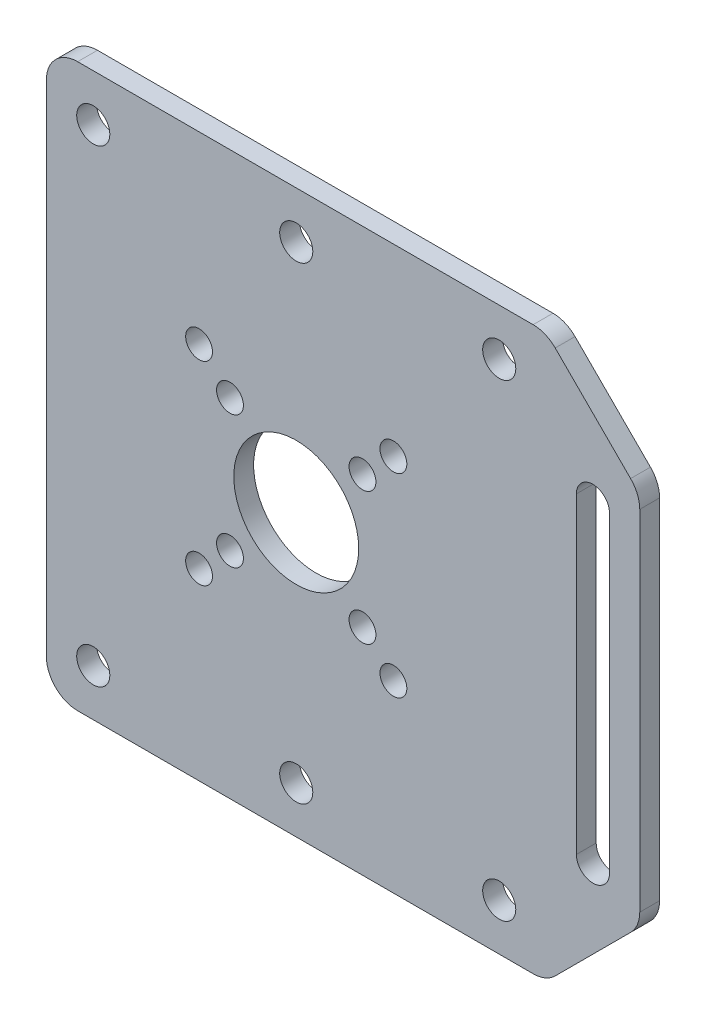
ISO-10303-21;
HEADER;
FILE_DESCRIPTION(('STEP AP214'),'2;1');
FILE_NAME('part.step','',(''),(''),'','','');
FILE_SCHEMA(('AUTOMOTIVE_DESIGN { 1 0 10303 214 1 1 1 1 }'));
ENDSEC;
DATA;
#1=APPLICATION_CONTEXT('core data for automotive mechanical design processes');
#2=APPLICATION_PROTOCOL_DEFINITION('international standard','automotive_design',2000,#1);
#3=PRODUCT_CONTEXT('',#1,'mechanical');
#4=PRODUCT('Part','Part','',(#3));
#5=PRODUCT_RELATED_PRODUCT_CATEGORY('part','',(#4));
#6=PRODUCT_DEFINITION_FORMATION('','',#4);
#7=PRODUCT_DEFINITION_CONTEXT('part definition',#1,'design');
#8=PRODUCT_DEFINITION('design','',#6,#7);
#9=PRODUCT_DEFINITION_SHAPE('','',#8);
#10=(LENGTH_UNIT() NAMED_UNIT(*) SI_UNIT(.MILLI.,.METRE.));
#11=(NAMED_UNIT(*) PLANE_ANGLE_UNIT() SI_UNIT($,.RADIAN.));
#12=(NAMED_UNIT(*) SI_UNIT($,.STERADIAN.) SOLID_ANGLE_UNIT());
#13=UNCERTAINTY_MEASURE_WITH_UNIT(LENGTH_MEASURE(1.E-05),#10,'distance_accuracy_value','');
#14=(GEOMETRIC_REPRESENTATION_CONTEXT(3) GLOBAL_UNCERTAINTY_ASSIGNED_CONTEXT((#13)) GLOBAL_UNIT_ASSIGNED_CONTEXT((#10,
#11,#12)) REPRESENTATION_CONTEXT('',''));
#15=CARTESIAN_POINT('',(0.,0.,0.));
#16=DIRECTION('',(0.,0.,1.));
#17=DIRECTION('',(1.,0.,0.));
#18=AXIS2_PLACEMENT_3D('',#15,#16,#17);
#19=CARTESIAN_POINT('',(-40.,45.,-3.175));
#20=DIRECTION('',(-1.,0.,0.));
#21=DIRECTION('',(0.,0.,1.));
#22=AXIS2_PLACEMENT_3D('',#19,#20,#21);
#23=PLANE('',#22);
#24=DIRECTION('',(0.,-1.,0.));
#25=VECTOR('',#24,1.);
#26=CARTESIAN_POINT('',(-40.,45.,-3.175));
#27=LINE('',#26,#25);
#28=CARTESIAN_POINT('',(-40.,40.,-3.175));
#29=VERTEX_POINT('',#28);
#30=CARTESIAN_POINT('',(-40.,-40.,-3.175));
#31=VERTEX_POINT('',#30);
#32=EDGE_CURVE('E207',#29,#31,#27,.T.);
#33=ORIENTED_EDGE('',*,*,#32,.T.);
#34=DIRECTION('',(0.,0.,1.));
#35=VECTOR('',#34,1.);
#36=CARTESIAN_POINT('',(-40.,-40.,-3.175));
#37=LINE('',#36,#35);
#38=CARTESIAN_POINT('',(-40.,-40.,0.));
#39=VERTEX_POINT('',#38);
#40=EDGE_CURVE('E11',#31,#39,#37,.T.);
#41=ORIENTED_EDGE('',*,*,#40,.T.);
#42=DIRECTION('',(0.,-1.,0.));
#43=VECTOR('',#42,1.);
#44=CARTESIAN_POINT('',(-40.,45.,0.));
#45=LINE('',#44,#43);
#46=CARTESIAN_POINT('',(-40.,40.,0.));
#47=VERTEX_POINT('',#46);
#48=EDGE_CURVE('E204',#47,#39,#45,.T.);
#49=ORIENTED_EDGE('',*,*,#48,.F.);
#50=DIRECTION('',(0.,0.,1.));
#51=VECTOR('',#50,1.);
#52=CARTESIAN_POINT('',(-40.,40.,-3.175));
#53=LINE('',#52,#51);
#54=EDGE_CURVE('E47',#47,#29,#53,.F.);
#55=ORIENTED_EDGE('',*,*,#54,.T.);
#56=EDGE_LOOP('',(#33,#41,#49,#55));
#57=FACE_BOUND('',#56,.T.);
#58=ADVANCED_FACE('F39',(#57),#23,.T.);
#59=CARTESIAN_POINT('',(-40.,45.,-3.175));
#60=DIRECTION('',(0.,1.,0.));
#61=DIRECTION('',(0.,0.,1.));
#62=AXIS2_PLACEMENT_3D('',#59,#60,#61);
#63=PLANE('',#62);
#64=DIRECTION('',(-1.,0.,0.));
#65=VECTOR('',#64,1.);
#66=CARTESIAN_POINT('',(-40.,45.,0.));
#67=LINE('',#66,#65);
#68=CARTESIAN_POINT('',(37.9289321881345,45.,0.));
#69=VERTEX_POINT('',#68);
#70=CARTESIAN_POINT('',(-35.,45.,0.));
#71=VERTEX_POINT('',#70);
#72=EDGE_CURVE('E211',#69,#71,#67,.T.);
#73=ORIENTED_EDGE('',*,*,#72,.F.);
#74=DIRECTION('',(0.,0.,1.));
#75=VECTOR('',#74,1.);
#76=CARTESIAN_POINT('',(37.9289321881345,45.,-3.175));
#77=LINE('',#76,#75);
#78=CARTESIAN_POINT('',(37.9289321881345,45.,-3.175));
#79=VERTEX_POINT('',#78);
#80=EDGE_CURVE('E286',#69,#79,#77,.F.);
#81=ORIENTED_EDGE('',*,*,#80,.T.);
#82=DIRECTION('',(-1.,0.,0.));
#83=VECTOR('',#82,1.);
#84=CARTESIAN_POINT('',(-40.,45.,-3.175));
#85=LINE('',#84,#83);
#86=CARTESIAN_POINT('',(-35.,45.,-3.175));
#87=VERTEX_POINT('',#86);
#88=EDGE_CURVE('E222',#79,#87,#85,.T.);
#89=ORIENTED_EDGE('',*,*,#88,.T.);
#90=DIRECTION('',(0.,0.,1.));
#91=VECTOR('',#90,1.);
#92=CARTESIAN_POINT('',(-35.,45.,-3.175));
#93=LINE('',#92,#91);
#94=EDGE_CURVE('E283',#87,#71,#93,.T.);
#95=ORIENTED_EDGE('',*,*,#94,.T.);
#96=EDGE_LOOP('',(#73,#81,#89,#95));
#97=FACE_BOUND('',#96,.T.);
#98=ADVANCED_FACE('F301',(#97),#63,.T.);
#99=CARTESIAN_POINT('',(40.,45.,-3.175));
#100=DIRECTION('',(0.707106781186548,0.707106781186548,0.));
#101=DIRECTION('',(-0.707106781186548,0.707106781186548,0.));
#102=AXIS2_PLACEMENT_3D('',#99,#100,#101);
#103=PLANE('',#102);
#104=DIRECTION('',(-0.707106781186547,0.707106781186547,0.));
#105=VECTOR('',#104,1.);
#106=CARTESIAN_POINT('',(40.,45.,0.));
#107=LINE('',#106,#105);
#108=CARTESIAN_POINT('',(53.5355339059327,31.4644660940673,0.));
#109=VERTEX_POINT('',#108);
#110=CARTESIAN_POINT('',(41.4644660940673,43.5355339059327,0.));
#111=VERTEX_POINT('',#110);
#112=EDGE_CURVE('E237',#109,#111,#107,.T.);
#113=ORIENTED_EDGE('',*,*,#112,.F.);
#114=DIRECTION('',(0.,0.,1.));
#115=VECTOR('',#114,1.);
#116=CARTESIAN_POINT('',(53.5355339059327,31.4644660940673,-3.175));
#117=LINE('',#116,#115);
#118=CARTESIAN_POINT('',(53.5355339059327,31.4644660940673,-3.175));
#119=VERTEX_POINT('',#118);
#120=EDGE_CURVE('E281',#109,#119,#117,.F.);
#121=ORIENTED_EDGE('',*,*,#120,.T.);
#122=DIRECTION('',(-0.707106781186547,0.707106781186547,0.));
#123=VECTOR('',#122,1.);
#124=CARTESIAN_POINT('',(40.,45.,-3.175));
#125=LINE('',#124,#123);
#126=CARTESIAN_POINT('',(41.4644660940673,43.5355339059327,-3.175));
#127=VERTEX_POINT('',#126);
#128=EDGE_CURVE('E219',#119,#127,#125,.T.);
#129=ORIENTED_EDGE('',*,*,#128,.T.);
#130=DIRECTION('',(0.,0.,1.));
#131=VECTOR('',#130,1.);
#132=CARTESIAN_POINT('',(41.4644660940673,43.5355339059327,-3.175));
#133=LINE('',#132,#131);
#134=EDGE_CURVE('E278',#127,#111,#133,.T.);
#135=ORIENTED_EDGE('',*,*,#134,.T.);
#136=EDGE_LOOP('',(#113,#121,#129,#135));
#137=FACE_BOUND('',#136,.T.);
#138=ADVANCED_FACE('F311',(#137),#103,.T.);
#139=CARTESIAN_POINT('',(55.,30.,-3.175));
#140=DIRECTION('',(1.,0.,0.));
#141=DIRECTION('',(0.,0.,-1.));
#142=AXIS2_PLACEMENT_3D('',#139,#140,#141);
#143=PLANE('',#142);
#144=DIRECTION('',(0.,1.,0.));
#145=VECTOR('',#144,1.);
#146=CARTESIAN_POINT('',(55.,30.,0.));
#147=LINE('',#146,#145);
#148=CARTESIAN_POINT('',(55.,-27.9289321881345,0.));
#149=VERTEX_POINT('',#148);
#150=CARTESIAN_POINT('',(55.,27.9289321881345,0.));
#151=VERTEX_POINT('',#150);
#152=EDGE_CURVE('E234',#149,#151,#147,.T.);
#153=ORIENTED_EDGE('',*,*,#152,.F.);
#154=DIRECTION('',(0.,0.,1.));
#155=VECTOR('',#154,1.);
#156=CARTESIAN_POINT('',(55.,-27.9289321881345,-3.175));
#157=LINE('',#156,#155);
#158=CARTESIAN_POINT('',(55.,-27.9289321881345,-3.175));
#159=VERTEX_POINT('',#158);
#160=EDGE_CURVE('E61',#149,#159,#157,.F.);
#161=ORIENTED_EDGE('',*,*,#160,.T.);
#162=DIRECTION('',(0.,1.,0.));
#163=VECTOR('',#162,1.);
#164=CARTESIAN_POINT('',(55.,30.,-3.175));
#165=LINE('',#164,#163);
#166=CARTESIAN_POINT('',(55.,27.9289321881345,-3.175));
#167=VERTEX_POINT('',#166);
#168=EDGE_CURVE('E217',#159,#167,#165,.T.);
#169=ORIENTED_EDGE('',*,*,#168,.T.);
#170=DIRECTION('',(0.,0.,1.));
#171=VECTOR('',#170,1.);
#172=CARTESIAN_POINT('',(55.,27.9289321881345,-3.175));
#173=LINE('',#172,#171);
#174=EDGE_CURVE('E274',#167,#151,#173,.T.);
#175=ORIENTED_EDGE('',*,*,#174,.T.);
#176=EDGE_LOOP('',(#153,#161,#169,#175));
#177=FACE_BOUND('',#176,.T.);
#178=ADVANCED_FACE('F316',(#177),#143,.T.);
#179=CARTESIAN_POINT('',(55.,-30.,-3.175));
#180=DIRECTION('',(0.707106781186548,-0.707106781186548,0.));
#181=DIRECTION('',(0.707106781186548,0.707106781186548,0.));
#182=AXIS2_PLACEMENT_3D('',#179,#180,#181);
#183=PLANE('',#182);
#184=DIRECTION('',(0.707106781186547,0.707106781186547,0.));
#185=VECTOR('',#184,1.);
#186=CARTESIAN_POINT('',(55.,-30.,0.));
#187=LINE('',#186,#185);
#188=CARTESIAN_POINT('',(41.4644660940673,-43.5355339059327,0.));
#189=VERTEX_POINT('',#188);
#190=CARTESIAN_POINT('',(53.5355339059327,-31.4644660940673,0.));
#191=VERTEX_POINT('',#190);
#192=EDGE_CURVE('E231',#189,#191,#187,.T.);
#193=ORIENTED_EDGE('',*,*,#192,.F.);
#194=DIRECTION('',(0.,0.,1.));
#195=VECTOR('',#194,1.);
#196=CARTESIAN_POINT('',(41.4644660940673,-43.5355339059327,-3.175));
#197=LINE('',#196,#195);
#198=CARTESIAN_POINT('',(41.4644660940673,-43.5355339059327,-3.175));
#199=VERTEX_POINT('',#198);
#200=EDGE_CURVE('E261',#189,#199,#197,.F.);
#201=ORIENTED_EDGE('',*,*,#200,.T.);
#202=DIRECTION('',(0.707106781186547,0.707106781186547,0.));
#203=VECTOR('',#202,1.);
#204=CARTESIAN_POINT('',(55.,-30.,-3.175));
#205=LINE('',#204,#203);
#206=CARTESIAN_POINT('',(53.5355339059327,-31.4644660940673,-3.175));
#207=VERTEX_POINT('',#206);
#208=EDGE_CURVE('E214',#199,#207,#205,.T.);
#209=ORIENTED_EDGE('',*,*,#208,.T.);
#210=DIRECTION('',(0.,0.,1.));
#211=VECTOR('',#210,1.);
#212=CARTESIAN_POINT('',(53.5355339059327,-31.4644660940673,-3.175));
#213=LINE('',#212,#211);
#214=EDGE_CURVE('E258',#207,#191,#213,.T.);
#215=ORIENTED_EDGE('',*,*,#214,.T.);
#216=EDGE_LOOP('',(#193,#201,#209,#215));
#217=FACE_BOUND('',#216,.T.);
#218=ADVANCED_FACE('F323',(#217),#183,.T.);
#219=CARTESIAN_POINT('',(-40.,-45.,-3.175));
#220=DIRECTION('',(0.,-1.,0.));
#221=DIRECTION('',(0.,0.,-1.));
#222=AXIS2_PLACEMENT_3D('',#219,#220,#221);
#223=PLANE('',#222);
#224=DIRECTION('',(1.,0.,0.));
#225=VECTOR('',#224,1.);
#226=CARTESIAN_POINT('',(-40.,-45.,-3.175));
#227=LINE('',#226,#225);
#228=CARTESIAN_POINT('',(-35.,-45.,-3.175));
#229=VERTEX_POINT('',#228);
#230=CARTESIAN_POINT('',(37.9289321881345,-45.,-3.175));
#231=VERTEX_POINT('',#230);
#232=EDGE_CURVE('E210',#229,#231,#227,.T.);
#233=ORIENTED_EDGE('',*,*,#232,.T.);
#234=DIRECTION('',(0.,0.,1.));
#235=VECTOR('',#234,1.);
#236=CARTESIAN_POINT('',(37.9289321881345,-45.,-3.175));
#237=LINE('',#236,#235);
#238=CARTESIAN_POINT('',(37.9289321881345,-45.,0.));
#239=VERTEX_POINT('',#238);
#240=EDGE_CURVE('E243',#231,#239,#237,.T.);
#241=ORIENTED_EDGE('',*,*,#240,.T.);
#242=DIRECTION('',(1.,0.,0.));
#243=VECTOR('',#242,1.);
#244=CARTESIAN_POINT('',(-40.,-45.,0.));
#245=LINE('',#244,#243);
#246=CARTESIAN_POINT('',(-35.,-45.,0.));
#247=VERTEX_POINT('',#246);
#248=EDGE_CURVE('E228',#247,#239,#245,.T.);
#249=ORIENTED_EDGE('',*,*,#248,.F.);
#250=DIRECTION('',(0.,0.,1.));
#251=VECTOR('',#250,1.);
#252=CARTESIAN_POINT('',(-35.,-45.,-3.175));
#253=LINE('',#252,#251);
#254=EDGE_CURVE('E225',#247,#229,#253,.F.);
#255=ORIENTED_EDGE('',*,*,#254,.T.);
#256=EDGE_LOOP('',(#233,#241,#249,#255));
#257=FACE_BOUND('',#256,.T.);
#258=ADVANCED_FACE('F331',(#257),#223,.T.);
#259=CARTESIAN_POINT('',(0.,0.,-3.175));
#260=DIRECTION('',(0.,0.,1.));
#261=DIRECTION('',(1.,0.,0.));
#262=AXIS2_PLACEMENT_3D('',#259,#260,#261);
#263=PLANE('',#262);
#264=CARTESIAN_POINT('',(-32.5,37.5,-3.175));
#265=DIRECTION('',(0.,0.,1.));
#266=DIRECTION('',(1.,0.,0.));
#267=AXIS2_PLACEMENT_3D('',#264,#265,#266);
#268=CIRCLE('',#267,2.65);
#269=CARTESIAN_POINT('',(-29.85,37.5,-3.175));
#270=VERTEX_POINT('',#269);
#271=EDGE_CURVE('E662',#270,#270,#268,.T.);
#272=ORIENTED_EDGE('',*,*,#271,.T.);
#273=EDGE_LOOP('',(#272));
#274=FACE_BOUND('',#273,.T.);
#275=CARTESIAN_POINT('',(32.5,37.5,-3.175));
#276=DIRECTION('',(0.,0.,1.));
#277=DIRECTION('',(1.,0.,0.));
#278=AXIS2_PLACEMENT_3D('',#275,#276,#277);
#279=CIRCLE('',#278,2.65);
#280=CARTESIAN_POINT('',(35.15,37.5,-3.175));
#281=VERTEX_POINT('',#280);
#282=EDGE_CURVE('E666',#281,#281,#279,.T.);
#283=ORIENTED_EDGE('',*,*,#282,.T.);
#284=EDGE_LOOP('',(#283));
#285=FACE_BOUND('',#284,.T.);
#286=CARTESIAN_POINT('',(32.5,-37.5,-3.175));
#287=DIRECTION('',(0.,0.,1.));
#288=DIRECTION('',(1.,0.,0.));
#289=AXIS2_PLACEMENT_3D('',#286,#287,#288);
#290=CIRCLE('',#289,2.65);
#291=CARTESIAN_POINT('',(35.15,-37.5,-3.175));
#292=VERTEX_POINT('',#291);
#293=EDGE_CURVE('E670',#292,#292,#290,.T.);
#294=ORIENTED_EDGE('',*,*,#293,.T.);
#295=EDGE_LOOP('',(#294));
#296=FACE_BOUND('',#295,.T.);
#297=CARTESIAN_POINT('',(-32.5,-37.5,-3.175));
#298=DIRECTION('',(0.,0.,1.));
#299=DIRECTION('',(1.,0.,0.));
#300=AXIS2_PLACEMENT_3D('',#297,#298,#299);
#301=CIRCLE('',#300,2.65);
#302=CARTESIAN_POINT('',(-29.85,-37.5,-3.175));
#303=VERTEX_POINT('',#302);
#304=EDGE_CURVE('E674',#303,#303,#301,.T.);
#305=ORIENTED_EDGE('',*,*,#304,.T.);
#306=EDGE_LOOP('',(#305));
#307=FACE_BOUND('',#306,.T.);
#308=CARTESIAN_POINT('',(0.,37.5,-3.175));
#309=DIRECTION('',(0.,0.,1.));
#310=DIRECTION('',(1.,0.,0.));
#311=AXIS2_PLACEMENT_3D('',#308,#309,#310);
#312=CIRCLE('',#311,2.65);
#313=CARTESIAN_POINT('',(2.65,37.5,-3.175));
#314=VERTEX_POINT('',#313);
#315=EDGE_CURVE('E678',#314,#314,#312,.T.);
#316=ORIENTED_EDGE('',*,*,#315,.T.);
#317=EDGE_LOOP('',(#316));
#318=FACE_BOUND('',#317,.T.);
#319=CARTESIAN_POINT('',(0.,-37.5,-3.175));
#320=DIRECTION('',(0.,0.,1.));
#321=DIRECTION('',(1.,0.,0.));
#322=AXIS2_PLACEMENT_3D('',#319,#320,#321);
#323=CIRCLE('',#322,2.65);
#324=CARTESIAN_POINT('',(2.65,-37.5,-3.175));
#325=VERTEX_POINT('',#324);
#326=EDGE_CURVE('E682',#325,#325,#323,.T.);
#327=ORIENTED_EDGE('',*,*,#326,.T.);
#328=EDGE_LOOP('',(#327));
#329=FACE_BOUND('',#328,.T.);
#330=CARTESIAN_POINT('',(-15.556349186104,15.5563491861041,-3.175));
#331=DIRECTION('',(0.,0.,1.));
#332=DIRECTION('',(1.,0.,0.));
#333=AXIS2_PLACEMENT_3D('',#330,#331,#332);
#334=CIRCLE('',#333,2.15);
#335=CARTESIAN_POINT('',(-13.406349186104,15.5563491861041,-3.175));
#336=VERTEX_POINT('',#335);
#337=EDGE_CURVE('E686',#336,#336,#334,.T.);
#338=ORIENTED_EDGE('',*,*,#337,.T.);
#339=EDGE_LOOP('',(#338));
#340=FACE_BOUND('',#339,.T.);
#341=CARTESIAN_POINT('',(15.5563491861041,15.556349186104,-3.175));
#342=DIRECTION('',(0.,0.,1.));
#343=DIRECTION('',(1.,0.,0.));
#344=AXIS2_PLACEMENT_3D('',#341,#342,#343);
#345=CIRCLE('',#344,2.15);
#346=CARTESIAN_POINT('',(17.7063491861041,15.556349186104,-3.175));
#347=VERTEX_POINT('',#346);
#348=EDGE_CURVE('E690',#347,#347,#345,.T.);
#349=ORIENTED_EDGE('',*,*,#348,.T.);
#350=EDGE_LOOP('',(#349));
#351=FACE_BOUND('',#350,.T.);
#352=CARTESIAN_POINT('',(10.6066017177982,10.6066017177982,-3.175));
#353=DIRECTION('',(0.,0.,1.));
#354=DIRECTION('',(1.,0.,0.));
#355=AXIS2_PLACEMENT_3D('',#352,#353,#354);
#356=CIRCLE('',#355,2.15);
#357=CARTESIAN_POINT('',(12.7566017177982,10.6066017177982,-3.175));
#358=VERTEX_POINT('',#357);
#359=EDGE_CURVE('E694',#358,#358,#356,.T.);
#360=ORIENTED_EDGE('',*,*,#359,.T.);
#361=EDGE_LOOP('',(#360));
#362=FACE_BOUND('',#361,.T.);
#363=CARTESIAN_POINT('',(-10.6066017177982,10.6066017177982,-3.175));
#364=DIRECTION('',(0.,0.,1.));
#365=DIRECTION('',(1.,0.,0.));
#366=AXIS2_PLACEMENT_3D('',#363,#364,#365);
#367=CIRCLE('',#366,2.15);
#368=CARTESIAN_POINT('',(-8.4566017177982,10.6066017177982,-3.175));
#369=VERTEX_POINT('',#368);
#370=EDGE_CURVE('E698',#369,#369,#367,.T.);
#371=ORIENTED_EDGE('',*,*,#370,.T.);
#372=EDGE_LOOP('',(#371));
#373=FACE_BOUND('',#372,.T.);
#374=CARTESIAN_POINT('',(-15.5563491861041,-15.556349186104,-3.175));
#375=DIRECTION('',(0.,0.,1.));
#376=DIRECTION('',(1.,0.,0.));
#377=AXIS2_PLACEMENT_3D('',#374,#375,#376);
#378=CIRCLE('',#377,2.15);
#379=CARTESIAN_POINT('',(-13.4063491861041,-15.556349186104,-3.175));
#380=VERTEX_POINT('',#379);
#381=EDGE_CURVE('E702',#380,#380,#378,.T.);
#382=ORIENTED_EDGE('',*,*,#381,.T.);
#383=EDGE_LOOP('',(#382));
#384=FACE_BOUND('',#383,.T.);
#385=CARTESIAN_POINT('',(15.556349186104,-15.5563491861041,-3.175));
#386=DIRECTION('',(0.,0.,1.));
#387=DIRECTION('',(1.,0.,0.));
#388=AXIS2_PLACEMENT_3D('',#385,#386,#387);
#389=CIRCLE('',#388,2.15);
#390=CARTESIAN_POINT('',(17.706349186104,-15.5563491861041,-3.175));
#391=VERTEX_POINT('',#390);
#392=EDGE_CURVE('E706',#391,#391,#389,.T.);
#393=ORIENTED_EDGE('',*,*,#392,.T.);
#394=EDGE_LOOP('',(#393));
#395=FACE_BOUND('',#394,.T.);
#396=CARTESIAN_POINT('',(10.6066017177982,-10.6066017177982,-3.175));
#397=DIRECTION('',(0.,0.,1.));
#398=DIRECTION('',(1.,0.,0.));
#399=AXIS2_PLACEMENT_3D('',#396,#397,#398);
#400=CIRCLE('',#399,2.15);
#401=CARTESIAN_POINT('',(12.7566017177982,-10.6066017177982,-3.175));
#402=VERTEX_POINT('',#401);
#403=EDGE_CURVE('E710',#402,#402,#400,.T.);
#404=ORIENTED_EDGE('',*,*,#403,.T.);
#405=EDGE_LOOP('',(#404));
#406=FACE_BOUND('',#405,.T.);
#407=CARTESIAN_POINT('',(-10.6066017177982,-10.6066017177982,-3.175));
#408=DIRECTION('',(0.,0.,1.));
#409=DIRECTION('',(1.,0.,0.));
#410=AXIS2_PLACEMENT_3D('',#407,#408,#409);
#411=CIRCLE('',#410,2.15);
#412=CARTESIAN_POINT('',(-8.45660171779823,-10.6066017177982,-3.175));
#413=VERTEX_POINT('',#412);
#414=EDGE_CURVE('E185',#413,#413,#411,.T.);
#415=ORIENTED_EDGE('',*,*,#414,.T.);
#416=EDGE_LOOP('',(#415));
#417=FACE_BOUND('',#416,.T.);
#418=DIRECTION('',(0.,1.,0.));
#419=VECTOR('',#418,1.);
#420=CARTESIAN_POINT('',(50.15,25.,-3.175));
#421=LINE('',#420,#419);
#422=CARTESIAN_POINT('',(50.15,-25.,-3.175));
#423=VERTEX_POINT('',#422);
#424=CARTESIAN_POINT('',(50.15,25.,-3.175));
#425=VERTEX_POINT('',#424);
#426=EDGE_CURVE('E166',#423,#425,#421,.T.);
#427=ORIENTED_EDGE('',*,*,#426,.T.);
#428=CARTESIAN_POINT('',(47.5,25.,-3.175));
#429=DIRECTION('',(0.,0.,1.));
#430=DIRECTION('',(-1.,0.,0.));
#431=AXIS2_PLACEMENT_3D('',#428,#429,#430);
#432=CIRCLE('',#431,2.65);
#433=CARTESIAN_POINT('',(44.85,25.,-3.175));
#434=VERTEX_POINT('',#433);
#435=EDGE_CURVE('E158',#425,#434,#432,.T.);
#436=ORIENTED_EDGE('',*,*,#435,.T.);
#437=DIRECTION('',(0.,-1.,0.));
#438=VECTOR('',#437,1.);
#439=CARTESIAN_POINT('',(44.85,25.,-3.175));
#440=LINE('',#439,#438);
#441=CARTESIAN_POINT('',(44.85,-25.,-3.175));
#442=VERTEX_POINT('',#441);
#443=EDGE_CURVE('E170',#434,#442,#440,.T.);
#444=ORIENTED_EDGE('',*,*,#443,.T.);
#445=CARTESIAN_POINT('',(47.5,-25.,-3.175));
#446=DIRECTION('',(0.,0.,1.));
#447=DIRECTION('',(-1.,0.,0.));
#448=AXIS2_PLACEMENT_3D('',#445,#446,#447);
#449=CIRCLE('',#448,2.65);
#450=EDGE_CURVE('E174',#442,#423,#449,.T.);
#451=ORIENTED_EDGE('',*,*,#450,.T.);
#452=EDGE_LOOP('',(#427,#436,#444,#451));
#453=FACE_BOUND('',#452,.T.);
#454=CARTESIAN_POINT('',(0.,0.,-3.175));
#455=DIRECTION('',(0.,0.,1.));
#456=DIRECTION('',(1.,0.,0.));
#457=AXIS2_PLACEMENT_3D('',#454,#455,#456);
#458=CIRCLE('',#457,9.99999999999998);
#459=CARTESIAN_POINT('',(9.99999999999998,0.,-3.175));
#460=VERTEX_POINT('',#459);
#461=EDGE_CURVE('E201',#460,#460,#458,.T.);
#462=ORIENTED_EDGE('',*,*,#461,.T.);
#463=EDGE_LOOP('',(#462));
#464=FACE_BOUND('',#463,.T.);
#465=ORIENTED_EDGE('',*,*,#208,.F.);
#466=CARTESIAN_POINT('',(37.9289321881345,-40.,-3.175));
#467=DIRECTION('',(0.,0.,1.));
#468=DIRECTION('',(1.,0.,0.));
#469=AXIS2_PLACEMENT_3D('',#466,#467,#468);
#470=CIRCLE('',#469,5.);
#471=EDGE_CURVE('E272',#199,#231,#470,.F.);
#472=ORIENTED_EDGE('',*,*,#471,.T.);
#473=ORIENTED_EDGE('',*,*,#232,.F.);
#474=CARTESIAN_POINT('',(-35.,-40.,-3.175));
#475=DIRECTION('',(0.,0.,1.));
#476=DIRECTION('',(1.,0.,0.));
#477=AXIS2_PLACEMENT_3D('',#474,#475,#476);
#478=CIRCLE('',#477,5.);
#479=EDGE_CURVE('E265',#229,#31,#478,.F.);
#480=ORIENTED_EDGE('',*,*,#479,.T.);
#481=ORIENTED_EDGE('',*,*,#32,.F.);
#482=CARTESIAN_POINT('',(-35.,40.,-3.175));
#483=DIRECTION('',(0.,0.,1.));
#484=DIRECTION('',(1.,0.,0.));
#485=AXIS2_PLACEMENT_3D('',#482,#483,#484);
#486=CIRCLE('',#485,5.);
#487=EDGE_CURVE('E263',#29,#87,#486,.F.);
#488=ORIENTED_EDGE('',*,*,#487,.T.);
#489=ORIENTED_EDGE('',*,*,#88,.F.);
#490=CARTESIAN_POINT('',(37.9289321881345,40.,-3.175));
#491=DIRECTION('',(0.,0.,1.));
#492=DIRECTION('',(1.,0.,0.));
#493=AXIS2_PLACEMENT_3D('',#490,#491,#492);
#494=CIRCLE('',#493,5.);
#495=EDGE_CURVE('E267',#79,#127,#494,.F.);
#496=ORIENTED_EDGE('',*,*,#495,.T.);
#497=ORIENTED_EDGE('',*,*,#128,.F.);
#498=CARTESIAN_POINT('',(50.,27.9289321881345,-3.175));
#499=DIRECTION('',(0.,0.,1.));
#500=DIRECTION('',(1.,0.,0.));
#501=AXIS2_PLACEMENT_3D('',#498,#499,#500);
#502=CIRCLE('',#501,5.);
#503=EDGE_CURVE('E54',#119,#167,#502,.F.);
#504=ORIENTED_EDGE('',*,*,#503,.T.);
#505=ORIENTED_EDGE('',*,*,#168,.F.);
#506=CARTESIAN_POINT('',(50.,-27.9289321881345,-3.175));
#507=DIRECTION('',(0.,0.,1.));
#508=DIRECTION('',(1.,0.,0.));
#509=AXIS2_PLACEMENT_3D('',#506,#507,#508);
#510=CIRCLE('',#509,5.);
#511=EDGE_CURVE('E270',#159,#207,#510,.F.);
#512=ORIENTED_EDGE('',*,*,#511,.T.);
#513=EDGE_LOOP('',(#465,#472,#473,#480,#481,#488,#489,#496,#497,#504,#505,#512));
#514=FACE_BOUND('',#513,.T.);
#515=ADVANCED_FACE('F176',(#274,#285,#296,#307,#318,#329,#340,#351,#362,#373,#384,#395,#406,
#417,#453,#464,#514),#263,.F.);
#516=CARTESIAN_POINT('',(0.,0.,0.));
#517=DIRECTION('',(0.,0.,1.));
#518=DIRECTION('',(1.,0.,0.));
#519=AXIS2_PLACEMENT_3D('',#516,#517,#518);
#520=PLANE('',#519);
#521=CARTESIAN_POINT('',(-32.5,37.5,0.));
#522=DIRECTION('',(0.,0.,1.));
#523=DIRECTION('',(1.,0.,0.));
#524=AXIS2_PLACEMENT_3D('',#521,#522,#523);
#525=CIRCLE('',#524,2.65);
#526=CARTESIAN_POINT('',(-29.85,37.5,0.));
#527=VERTEX_POINT('',#526);
#528=EDGE_CURVE('E767',#527,#527,#525,.T.);
#529=ORIENTED_EDGE('',*,*,#528,.F.);
#530=EDGE_LOOP('',(#529));
#531=FACE_BOUND('',#530,.T.);
#532=CARTESIAN_POINT('',(32.5,37.5,0.));
#533=DIRECTION('',(0.,0.,1.));
#534=DIRECTION('',(1.,0.,0.));
#535=AXIS2_PLACEMENT_3D('',#532,#533,#534);
#536=CIRCLE('',#535,2.65);
#537=CARTESIAN_POINT('',(35.15,37.5,0.));
#538=VERTEX_POINT('',#537);
#539=EDGE_CURVE('E763',#538,#538,#536,.T.);
#540=ORIENTED_EDGE('',*,*,#539,.F.);
#541=EDGE_LOOP('',(#540));
#542=FACE_BOUND('',#541,.T.);
#543=CARTESIAN_POINT('',(32.5,-37.5,0.));
#544=DIRECTION('',(0.,0.,1.));
#545=DIRECTION('',(1.,0.,0.));
#546=AXIS2_PLACEMENT_3D('',#543,#544,#545);
#547=CIRCLE('',#546,2.65);
#548=CARTESIAN_POINT('',(35.15,-37.5,0.));
#549=VERTEX_POINT('',#548);
#550=EDGE_CURVE('E759',#549,#549,#547,.T.);
#551=ORIENTED_EDGE('',*,*,#550,.F.);
#552=EDGE_LOOP('',(#551));
#553=FACE_BOUND('',#552,.T.);
#554=CARTESIAN_POINT('',(-32.5,-37.5,0.));
#555=DIRECTION('',(0.,0.,1.));
#556=DIRECTION('',(1.,0.,0.));
#557=AXIS2_PLACEMENT_3D('',#554,#555,#556);
#558=CIRCLE('',#557,2.65);
#559=CARTESIAN_POINT('',(-29.85,-37.5,0.));
#560=VERTEX_POINT('',#559);
#561=EDGE_CURVE('E755',#560,#560,#558,.T.);
#562=ORIENTED_EDGE('',*,*,#561,.F.);
#563=EDGE_LOOP('',(#562));
#564=FACE_BOUND('',#563,.T.);
#565=CARTESIAN_POINT('',(0.,37.5,0.));
#566=DIRECTION('',(0.,0.,1.));
#567=DIRECTION('',(1.,0.,0.));
#568=AXIS2_PLACEMENT_3D('',#565,#566,#567);
#569=CIRCLE('',#568,2.65);
#570=CARTESIAN_POINT('',(2.65,37.5,0.));
#571=VERTEX_POINT('',#570);
#572=EDGE_CURVE('E751',#571,#571,#569,.T.);
#573=ORIENTED_EDGE('',*,*,#572,.F.);
#574=EDGE_LOOP('',(#573));
#575=FACE_BOUND('',#574,.T.);
#576=CARTESIAN_POINT('',(0.,-37.5,0.));
#577=DIRECTION('',(0.,0.,1.));
#578=DIRECTION('',(1.,0.,0.));
#579=AXIS2_PLACEMENT_3D('',#576,#577,#578);
#580=CIRCLE('',#579,2.65);
#581=CARTESIAN_POINT('',(2.65,-37.5,0.));
#582=VERTEX_POINT('',#581);
#583=EDGE_CURVE('E747',#582,#582,#580,.T.);
#584=ORIENTED_EDGE('',*,*,#583,.F.);
#585=EDGE_LOOP('',(#584));
#586=FACE_BOUND('',#585,.T.);
#587=CARTESIAN_POINT('',(-15.556349186104,15.5563491861041,0.));
#588=DIRECTION('',(0.,0.,1.));
#589=DIRECTION('',(1.,0.,0.));
#590=AXIS2_PLACEMENT_3D('',#587,#588,#589);
#591=CIRCLE('',#590,2.15);
#592=CARTESIAN_POINT('',(-13.406349186104,15.5563491861041,0.));
#593=VERTEX_POINT('',#592);
#594=EDGE_CURVE('E743',#593,#593,#591,.T.);
#595=ORIENTED_EDGE('',*,*,#594,.F.);
#596=EDGE_LOOP('',(#595));
#597=FACE_BOUND('',#596,.T.);
#598=CARTESIAN_POINT('',(15.5563491861041,15.556349186104,0.));
#599=DIRECTION('',(0.,0.,1.));
#600=DIRECTION('',(1.,0.,0.));
#601=AXIS2_PLACEMENT_3D('',#598,#599,#600);
#602=CIRCLE('',#601,2.15);
#603=CARTESIAN_POINT('',(17.7063491861041,15.556349186104,0.));
#604=VERTEX_POINT('',#603);
#605=EDGE_CURVE('E739',#604,#604,#602,.T.);
#606=ORIENTED_EDGE('',*,*,#605,.F.);
#607=EDGE_LOOP('',(#606));
#608=FACE_BOUND('',#607,.T.);
#609=CARTESIAN_POINT('',(10.6066017177982,10.6066017177982,0.));
#610=DIRECTION('',(0.,0.,1.));
#611=DIRECTION('',(1.,0.,0.));
#612=AXIS2_PLACEMENT_3D('',#609,#610,#611);
#613=CIRCLE('',#612,2.15);
#614=CARTESIAN_POINT('',(12.7566017177982,10.6066017177982,0.));
#615=VERTEX_POINT('',#614);
#616=EDGE_CURVE('E735',#615,#615,#613,.T.);
#617=ORIENTED_EDGE('',*,*,#616,.F.);
#618=EDGE_LOOP('',(#617));
#619=FACE_BOUND('',#618,.T.);
#620=CARTESIAN_POINT('',(-10.6066017177982,10.6066017177982,0.));
#621=DIRECTION('',(0.,0.,1.));
#622=DIRECTION('',(1.,0.,0.));
#623=AXIS2_PLACEMENT_3D('',#620,#621,#622);
#624=CIRCLE('',#623,2.15);
#625=CARTESIAN_POINT('',(-8.4566017177982,10.6066017177982,0.));
#626=VERTEX_POINT('',#625);
#627=EDGE_CURVE('E731',#626,#626,#624,.T.);
#628=ORIENTED_EDGE('',*,*,#627,.F.);
#629=EDGE_LOOP('',(#628));
#630=FACE_BOUND('',#629,.T.);
#631=CARTESIAN_POINT('',(-15.5563491861041,-15.556349186104,0.));
#632=DIRECTION('',(0.,0.,1.));
#633=DIRECTION('',(1.,0.,0.));
#634=AXIS2_PLACEMENT_3D('',#631,#632,#633);
#635=CIRCLE('',#634,2.15);
#636=CARTESIAN_POINT('',(-13.4063491861041,-15.556349186104,0.));
#637=VERTEX_POINT('',#636);
#638=EDGE_CURVE('E727',#637,#637,#635,.T.);
#639=ORIENTED_EDGE('',*,*,#638,.F.);
#640=EDGE_LOOP('',(#639));
#641=FACE_BOUND('',#640,.T.);
#642=CARTESIAN_POINT('',(15.556349186104,-15.5563491861041,0.));
#643=DIRECTION('',(0.,0.,1.));
#644=DIRECTION('',(1.,0.,0.));
#645=AXIS2_PLACEMENT_3D('',#642,#643,#644);
#646=CIRCLE('',#645,2.15);
#647=CARTESIAN_POINT('',(17.706349186104,-15.5563491861041,0.));
#648=VERTEX_POINT('',#647);
#649=EDGE_CURVE('E723',#648,#648,#646,.T.);
#650=ORIENTED_EDGE('',*,*,#649,.F.);
#651=EDGE_LOOP('',(#650));
#652=FACE_BOUND('',#651,.T.);
#653=CARTESIAN_POINT('',(10.6066017177982,-10.6066017177982,0.));
#654=DIRECTION('',(0.,0.,1.));
#655=DIRECTION('',(1.,0.,0.));
#656=AXIS2_PLACEMENT_3D('',#653,#654,#655);
#657=CIRCLE('',#656,2.15);
#658=CARTESIAN_POINT('',(12.7566017177982,-10.6066017177982,0.));
#659=VERTEX_POINT('',#658);
#660=EDGE_CURVE('E717',#659,#659,#657,.T.);
#661=ORIENTED_EDGE('',*,*,#660,.F.);
#662=EDGE_LOOP('',(#661));
#663=FACE_BOUND('',#662,.T.);
#664=CARTESIAN_POINT('',(-10.6066017177982,-10.6066017177982,0.));
#665=DIRECTION('',(0.,0.,1.));
#666=DIRECTION('',(1.,0.,0.));
#667=AXIS2_PLACEMENT_3D('',#664,#665,#666);
#668=CIRCLE('',#667,2.15);
#669=CARTESIAN_POINT('',(-8.45660171779823,-10.6066017177982,0.));
#670=VERTEX_POINT('',#669);
#671=EDGE_CURVE('E713',#670,#670,#668,.T.);
#672=ORIENTED_EDGE('',*,*,#671,.F.);
#673=EDGE_LOOP('',(#672));
#674=FACE_BOUND('',#673,.T.);
#675=CARTESIAN_POINT('',(47.5,25.,0.));
#676=DIRECTION('',(0.,0.,1.));
#677=DIRECTION('',(-1.,0.,0.));
#678=AXIS2_PLACEMENT_3D('',#675,#676,#677);
#679=CIRCLE('',#678,2.65);
#680=CARTESIAN_POINT('',(50.15,25.,0.));
#681=VERTEX_POINT('',#680);
#682=CARTESIAN_POINT('',(44.85,25.,0.));
#683=VERTEX_POINT('',#682);
#684=EDGE_CURVE('E161',#681,#683,#679,.T.);
#685=ORIENTED_EDGE('',*,*,#684,.F.);
#686=DIRECTION('',(0.,1.,0.));
#687=VECTOR('',#686,1.);
#688=CARTESIAN_POINT('',(50.15,25.,0.));
#689=LINE('',#688,#687);
#690=CARTESIAN_POINT('',(50.15,-25.,0.));
#691=VERTEX_POINT('',#690);
#692=EDGE_CURVE('E179',#691,#681,#689,.T.);
#693=ORIENTED_EDGE('',*,*,#692,.F.);
#694=CARTESIAN_POINT('',(47.5,-25.,0.));
#695=DIRECTION('',(0.,0.,1.));
#696=DIRECTION('',(-1.,0.,0.));
#697=AXIS2_PLACEMENT_3D('',#694,#695,#696);
#698=CIRCLE('',#697,2.65);
#699=CARTESIAN_POINT('',(44.85,-25.,0.));
#700=VERTEX_POINT('',#699);
#701=EDGE_CURVE('E182',#700,#691,#698,.T.);
#702=ORIENTED_EDGE('',*,*,#701,.F.);
#703=DIRECTION('',(0.,-1.,0.));
#704=VECTOR('',#703,1.);
#705=CARTESIAN_POINT('',(44.85,25.,0.));
#706=LINE('',#705,#704);
#707=EDGE_CURVE('E191',#683,#700,#706,.T.);
#708=ORIENTED_EDGE('',*,*,#707,.F.);
#709=EDGE_LOOP('',(#685,#693,#702,#708));
#710=FACE_BOUND('',#709,.T.);
#711=CARTESIAN_POINT('',(0.,0.,0.));
#712=DIRECTION('',(0.,0.,1.));
#713=DIRECTION('',(1.,0.,0.));
#714=AXIS2_PLACEMENT_3D('',#711,#712,#713);
#715=CIRCLE('',#714,9.99999999999998);
#716=CARTESIAN_POINT('',(9.99999999999998,0.,0.));
#717=VERTEX_POINT('',#716);
#718=EDGE_CURVE('E197',#717,#717,#715,.T.);
#719=ORIENTED_EDGE('',*,*,#718,.F.);
#720=EDGE_LOOP('',(#719));
#721=FACE_BOUND('',#720,.T.);
#722=ORIENTED_EDGE('',*,*,#248,.T.);
#723=CARTESIAN_POINT('',(37.9289321881345,-40.,0.));
#724=DIRECTION('',(0.,0.,1.));
#725=DIRECTION('',(1.,0.,0.));
#726=AXIS2_PLACEMENT_3D('',#723,#724,#725);
#727=CIRCLE('',#726,5.);
#728=EDGE_CURVE('E256',#239,#189,#727,.T.);
#729=ORIENTED_EDGE('',*,*,#728,.T.);
#730=ORIENTED_EDGE('',*,*,#192,.T.);
#731=CARTESIAN_POINT('',(50.,-27.9289321881345,0.));
#732=DIRECTION('',(0.,0.,1.));
#733=DIRECTION('',(1.,0.,0.));
#734=AXIS2_PLACEMENT_3D('',#731,#732,#733);
#735=CIRCLE('',#734,5.);
#736=EDGE_CURVE('E254',#191,#149,#735,.T.);
#737=ORIENTED_EDGE('',*,*,#736,.T.);
#738=ORIENTED_EDGE('',*,*,#152,.T.);
#739=CARTESIAN_POINT('',(50.,27.9289321881345,0.));
#740=DIRECTION('',(0.,0.,1.));
#741=DIRECTION('',(1.,0.,0.));
#742=AXIS2_PLACEMENT_3D('',#739,#740,#741);
#743=CIRCLE('',#742,5.);
#744=EDGE_CURVE('E252',#151,#109,#743,.T.);
#745=ORIENTED_EDGE('',*,*,#744,.T.);
#746=ORIENTED_EDGE('',*,*,#112,.T.);
#747=CARTESIAN_POINT('',(37.9289321881345,40.,0.));
#748=DIRECTION('',(0.,0.,1.));
#749=DIRECTION('',(1.,0.,0.));
#750=AXIS2_PLACEMENT_3D('',#747,#748,#749);
#751=CIRCLE('',#750,5.);
#752=EDGE_CURVE('E250',#111,#69,#751,.T.);
#753=ORIENTED_EDGE('',*,*,#752,.T.);
#754=ORIENTED_EDGE('',*,*,#72,.T.);
#755=CARTESIAN_POINT('',(-35.,40.,0.));
#756=DIRECTION('',(0.,0.,1.));
#757=DIRECTION('',(1.,0.,0.));
#758=AXIS2_PLACEMENT_3D('',#755,#756,#757);
#759=CIRCLE('',#758,5.);
#760=EDGE_CURVE('E246',#71,#47,#759,.T.);
#761=ORIENTED_EDGE('',*,*,#760,.T.);
#762=ORIENTED_EDGE('',*,*,#48,.T.);
#763=CARTESIAN_POINT('',(-35.,-40.,0.));
#764=DIRECTION('',(0.,0.,1.));
#765=DIRECTION('',(1.,0.,0.));
#766=AXIS2_PLACEMENT_3D('',#763,#764,#765);
#767=CIRCLE('',#766,5.);
#768=EDGE_CURVE('E248',#39,#247,#767,.T.);
#769=ORIENTED_EDGE('',*,*,#768,.T.);
#770=EDGE_LOOP('',(#722,#729,#730,#737,#738,#745,#746,#753,#754,#761,#762,#769));
#771=FACE_BOUND('',#770,.T.);
#772=ADVANCED_FACE('F304',(#531,#542,#553,#564,#575,#586,#597,#608,#619,#630,#641,#652,#663,
#674,#710,#721,#771),#520,.T.);
#773=CARTESIAN_POINT('',(0.,0.,-3.175));
#774=DIRECTION('',(0.,0.,1.));
#775=DIRECTION('',(1.,0.,0.));
#776=AXIS2_PLACEMENT_3D('',#773,#774,#775);
#777=CYLINDRICAL_SURFACE('',#776,9.99999999999998);
#778=ORIENTED_EDGE('',*,*,#461,.F.);
#779=EDGE_LOOP('',(#778));
#780=FACE_BOUND('',#779,.T.);
#781=ORIENTED_EDGE('',*,*,#718,.T.);
#782=EDGE_LOOP('',(#781));
#783=FACE_BOUND('',#782,.T.);
#784=ADVANCED_FACE('F553',(#780,#783),#777,.F.);
#785=CARTESIAN_POINT('',(47.5,25.,-3.175));
#786=DIRECTION('',(0.,0.,1.));
#787=DIRECTION('',(1.,0.,0.));
#788=AXIS2_PLACEMENT_3D('',#785,#786,#787);
#789=CYLINDRICAL_SURFACE('',#788,2.65);
#790=ORIENTED_EDGE('',*,*,#684,.T.);
#791=DIRECTION('',(0.,0.,1.));
#792=VECTOR('',#791,1.);
#793=CARTESIAN_POINT('',(44.85,25.,-3.175));
#794=LINE('',#793,#792);
#795=EDGE_CURVE('E154',#434,#683,#794,.T.);
#796=ORIENTED_EDGE('',*,*,#795,.F.);
#797=ORIENTED_EDGE('',*,*,#435,.F.);
#798=DIRECTION('',(0.,0.,1.));
#799=VECTOR('',#798,1.);
#800=CARTESIAN_POINT('',(50.15,25.,-3.175));
#801=LINE('',#800,#799);
#802=EDGE_CURVE('E195',#425,#681,#801,.T.);
#803=ORIENTED_EDGE('',*,*,#802,.T.);
#804=EDGE_LOOP('',(#790,#796,#797,#803));
#805=FACE_BOUND('',#804,.T.);
#806=ADVANCED_FACE('F156',(#805),#789,.F.);
#807=CARTESIAN_POINT('',(50.15,25.,-3.175));
#808=DIRECTION('',(1.,0.,0.));
#809=DIRECTION('',(0.,0.,-1.));
#810=AXIS2_PLACEMENT_3D('',#807,#808,#809);
#811=PLANE('',#810);
#812=ORIENTED_EDGE('',*,*,#692,.T.);
#813=ORIENTED_EDGE('',*,*,#802,.F.);
#814=ORIENTED_EDGE('',*,*,#426,.F.);
#815=DIRECTION('',(0.,0.,1.));
#816=VECTOR('',#815,1.);
#817=CARTESIAN_POINT('',(50.15,-25.,-3.175));
#818=LINE('',#817,#816);
#819=EDGE_CURVE('E198',#423,#691,#818,.T.);
#820=ORIENTED_EDGE('',*,*,#819,.T.);
#821=EDGE_LOOP('',(#812,#813,#814,#820));
#822=FACE_BOUND('',#821,.T.);
#823=ADVANCED_FACE('F532',(#822),#811,.F.);
#824=CARTESIAN_POINT('',(47.5,-25.,-3.175));
#825=DIRECTION('',(0.,0.,1.));
#826=DIRECTION('',(1.,0.,0.));
#827=AXIS2_PLACEMENT_3D('',#824,#825,#826);
#828=CYLINDRICAL_SURFACE('',#827,2.65);
#829=ORIENTED_EDGE('',*,*,#701,.T.);
#830=ORIENTED_EDGE('',*,*,#819,.F.);
#831=ORIENTED_EDGE('',*,*,#450,.F.);
#832=DIRECTION('',(0.,0.,1.));
#833=VECTOR('',#832,1.);
#834=CARTESIAN_POINT('',(44.85,-25.,-3.175));
#835=LINE('',#834,#833);
#836=EDGE_CURVE('E165',#442,#700,#835,.T.);
#837=ORIENTED_EDGE('',*,*,#836,.T.);
#838=EDGE_LOOP('',(#829,#830,#831,#837));
#839=FACE_BOUND('',#838,.T.);
#840=ADVANCED_FACE('F522',(#839),#828,.F.);
#841=CARTESIAN_POINT('',(44.85,25.,-3.175));
#842=DIRECTION('',(-1.,0.,0.));
#843=DIRECTION('',(0.,0.,1.));
#844=AXIS2_PLACEMENT_3D('',#841,#842,#843);
#845=PLANE('',#844);
#846=ORIENTED_EDGE('',*,*,#707,.T.);
#847=ORIENTED_EDGE('',*,*,#836,.F.);
#848=ORIENTED_EDGE('',*,*,#443,.F.);
#849=ORIENTED_EDGE('',*,*,#795,.T.);
#850=EDGE_LOOP('',(#846,#847,#848,#849));
#851=FACE_BOUND('',#850,.T.);
#852=ADVANCED_FACE('F171',(#851),#845,.F.);
#853=CARTESIAN_POINT('',(-10.6066017177982,-10.6066017177982,0.));
#854=DIRECTION('',(0.,0.,1.));
#855=DIRECTION('',(1.,0.,0.));
#856=AXIS2_PLACEMENT_3D('',#853,#854,#855);
#857=CYLINDRICAL_SURFACE('',#856,2.15);
#858=ORIENTED_EDGE('',*,*,#414,.F.);
#859=EDGE_LOOP('',(#858));
#860=FACE_BOUND('',#859,.T.);
#861=ORIENTED_EDGE('',*,*,#671,.T.);
#862=EDGE_LOOP('',(#861));
#863=FACE_BOUND('',#862,.T.);
#864=ADVANCED_FACE('F504',(#860,#863),#857,.F.);
#865=CARTESIAN_POINT('',(10.6066017177982,-10.6066017177982,0.));
#866=DIRECTION('',(0.,0.,1.));
#867=DIRECTION('',(1.,0.,0.));
#868=AXIS2_PLACEMENT_3D('',#865,#866,#867);
#869=CYLINDRICAL_SURFACE('',#868,2.15);
#870=ORIENTED_EDGE('',*,*,#403,.F.);
#871=EDGE_LOOP('',(#870));
#872=FACE_BOUND('',#871,.T.);
#873=ORIENTED_EDGE('',*,*,#660,.T.);
#874=EDGE_LOOP('',(#873));
#875=FACE_BOUND('',#874,.T.);
#876=ADVANCED_FACE('F495',(#872,#875),#869,.F.);
#877=CARTESIAN_POINT('',(15.556349186104,-15.5563491861041,0.));
#878=DIRECTION('',(0.,0.,1.));
#879=DIRECTION('',(1.,0.,0.));
#880=AXIS2_PLACEMENT_3D('',#877,#878,#879);
#881=CYLINDRICAL_SURFACE('',#880,2.15);
#882=ORIENTED_EDGE('',*,*,#392,.F.);
#883=EDGE_LOOP('',(#882));
#884=FACE_BOUND('',#883,.T.);
#885=ORIENTED_EDGE('',*,*,#649,.T.);
#886=EDGE_LOOP('',(#885));
#887=FACE_BOUND('',#886,.T.);
#888=ADVANCED_FACE('F486',(#884,#887),#881,.F.);
#889=CARTESIAN_POINT('',(-15.5563491861041,-15.556349186104,0.));
#890=DIRECTION('',(0.,0.,1.));
#891=DIRECTION('',(1.,0.,0.));
#892=AXIS2_PLACEMENT_3D('',#889,#890,#891);
#893=CYLINDRICAL_SURFACE('',#892,2.15);
#894=ORIENTED_EDGE('',*,*,#381,.F.);
#895=EDGE_LOOP('',(#894));
#896=FACE_BOUND('',#895,.T.);
#897=ORIENTED_EDGE('',*,*,#638,.T.);
#898=EDGE_LOOP('',(#897));
#899=FACE_BOUND('',#898,.T.);
#900=ADVANCED_FACE('F477',(#896,#899),#893,.F.);
#901=CARTESIAN_POINT('',(-10.6066017177982,10.6066017177982,0.));
#902=DIRECTION('',(0.,0.,1.));
#903=DIRECTION('',(1.,0.,0.));
#904=AXIS2_PLACEMENT_3D('',#901,#902,#903);
#905=CYLINDRICAL_SURFACE('',#904,2.15);
#906=ORIENTED_EDGE('',*,*,#370,.F.);
#907=EDGE_LOOP('',(#906));
#908=FACE_BOUND('',#907,.T.);
#909=ORIENTED_EDGE('',*,*,#627,.T.);
#910=EDGE_LOOP('',(#909));
#911=FACE_BOUND('',#910,.T.);
#912=ADVANCED_FACE('F468',(#908,#911),#905,.F.);
#913=CARTESIAN_POINT('',(10.6066017177982,10.6066017177982,0.));
#914=DIRECTION('',(0.,0.,1.));
#915=DIRECTION('',(1.,0.,0.));
#916=AXIS2_PLACEMENT_3D('',#913,#914,#915);
#917=CYLINDRICAL_SURFACE('',#916,2.15);
#918=ORIENTED_EDGE('',*,*,#359,.F.);
#919=EDGE_LOOP('',(#918));
#920=FACE_BOUND('',#919,.T.);
#921=ORIENTED_EDGE('',*,*,#616,.T.);
#922=EDGE_LOOP('',(#921));
#923=FACE_BOUND('',#922,.T.);
#924=ADVANCED_FACE('F459',(#920,#923),#917,.F.);
#925=CARTESIAN_POINT('',(15.5563491861041,15.556349186104,0.));
#926=DIRECTION('',(0.,0.,1.));
#927=DIRECTION('',(1.,0.,0.));
#928=AXIS2_PLACEMENT_3D('',#925,#926,#927);
#929=CYLINDRICAL_SURFACE('',#928,2.15);
#930=ORIENTED_EDGE('',*,*,#348,.F.);
#931=EDGE_LOOP('',(#930));
#932=FACE_BOUND('',#931,.T.);
#933=ORIENTED_EDGE('',*,*,#605,.T.);
#934=EDGE_LOOP('',(#933));
#935=FACE_BOUND('',#934,.T.);
#936=ADVANCED_FACE('F450',(#932,#935),#929,.F.);
#937=CARTESIAN_POINT('',(-15.556349186104,15.5563491861041,0.));
#938=DIRECTION('',(0.,0.,1.));
#939=DIRECTION('',(1.,0.,0.));
#940=AXIS2_PLACEMENT_3D('',#937,#938,#939);
#941=CYLINDRICAL_SURFACE('',#940,2.15);
#942=ORIENTED_EDGE('',*,*,#337,.F.);
#943=EDGE_LOOP('',(#942));
#944=FACE_BOUND('',#943,.T.);
#945=ORIENTED_EDGE('',*,*,#594,.T.);
#946=EDGE_LOOP('',(#945));
#947=FACE_BOUND('',#946,.T.);
#948=ADVANCED_FACE('F441',(#944,#947),#941,.F.);
#949=CARTESIAN_POINT('',(0.,-37.5,0.));
#950=DIRECTION('',(0.,0.,1.));
#951=DIRECTION('',(1.,0.,0.));
#952=AXIS2_PLACEMENT_3D('',#949,#950,#951);
#953=CYLINDRICAL_SURFACE('',#952,2.65);
#954=ORIENTED_EDGE('',*,*,#326,.F.);
#955=EDGE_LOOP('',(#954));
#956=FACE_BOUND('',#955,.T.);
#957=ORIENTED_EDGE('',*,*,#583,.T.);
#958=EDGE_LOOP('',(#957));
#959=FACE_BOUND('',#958,.T.);
#960=ADVANCED_FACE('F432',(#956,#959),#953,.F.);
#961=CARTESIAN_POINT('',(0.,37.5,0.));
#962=DIRECTION('',(0.,0.,1.));
#963=DIRECTION('',(1.,0.,0.));
#964=AXIS2_PLACEMENT_3D('',#961,#962,#963);
#965=CYLINDRICAL_SURFACE('',#964,2.65);
#966=ORIENTED_EDGE('',*,*,#315,.F.);
#967=EDGE_LOOP('',(#966));
#968=FACE_BOUND('',#967,.T.);
#969=ORIENTED_EDGE('',*,*,#572,.T.);
#970=EDGE_LOOP('',(#969));
#971=FACE_BOUND('',#970,.T.);
#972=ADVANCED_FACE('F423',(#968,#971),#965,.F.);
#973=CARTESIAN_POINT('',(-32.5,-37.5,0.));
#974=DIRECTION('',(0.,0.,1.));
#975=DIRECTION('',(1.,0.,0.));
#976=AXIS2_PLACEMENT_3D('',#973,#974,#975);
#977=CYLINDRICAL_SURFACE('',#976,2.65);
#978=ORIENTED_EDGE('',*,*,#304,.F.);
#979=EDGE_LOOP('',(#978));
#980=FACE_BOUND('',#979,.T.);
#981=ORIENTED_EDGE('',*,*,#561,.T.);
#982=EDGE_LOOP('',(#981));
#983=FACE_BOUND('',#982,.T.);
#984=ADVANCED_FACE('F414',(#980,#983),#977,.F.);
#985=CARTESIAN_POINT('',(32.5,-37.5,0.));
#986=DIRECTION('',(0.,0.,1.));
#987=DIRECTION('',(1.,0.,0.));
#988=AXIS2_PLACEMENT_3D('',#985,#986,#987);
#989=CYLINDRICAL_SURFACE('',#988,2.65);
#990=ORIENTED_EDGE('',*,*,#293,.F.);
#991=EDGE_LOOP('',(#990));
#992=FACE_BOUND('',#991,.T.);
#993=ORIENTED_EDGE('',*,*,#550,.T.);
#994=EDGE_LOOP('',(#993));
#995=FACE_BOUND('',#994,.T.);
#996=ADVANCED_FACE('F405',(#992,#995),#989,.F.);
#997=CARTESIAN_POINT('',(32.5,37.5,0.));
#998=DIRECTION('',(0.,0.,1.));
#999=DIRECTION('',(1.,0.,0.));
#1000=AXIS2_PLACEMENT_3D('',#997,#998,#999);
#1001=CYLINDRICAL_SURFACE('',#1000,2.65);
#1002=ORIENTED_EDGE('',*,*,#282,.F.);
#1003=EDGE_LOOP('',(#1002));
#1004=FACE_BOUND('',#1003,.T.);
#1005=ORIENTED_EDGE('',*,*,#539,.T.);
#1006=EDGE_LOOP('',(#1005));
#1007=FACE_BOUND('',#1006,.T.);
#1008=ADVANCED_FACE('F396',(#1004,#1007),#1001,.F.);
#1009=CARTESIAN_POINT('',(-32.5,37.5,0.));
#1010=DIRECTION('',(0.,0.,1.));
#1011=DIRECTION('',(1.,0.,0.));
#1012=AXIS2_PLACEMENT_3D('',#1009,#1010,#1011);
#1013=CYLINDRICAL_SURFACE('',#1012,2.65);
#1014=ORIENTED_EDGE('',*,*,#271,.F.);
#1015=EDGE_LOOP('',(#1014));
#1016=FACE_BOUND('',#1015,.T.);
#1017=ORIENTED_EDGE('',*,*,#528,.T.);
#1018=EDGE_LOOP('',(#1017));
#1019=FACE_BOUND('',#1018,.T.);
#1020=ADVANCED_FACE('F352',(#1016,#1019),#1013,.F.);
#1021=CARTESIAN_POINT('',(37.9289321881345,-40.,-3.175));
#1022=DIRECTION('',(0.,0.,1.));
#1023=DIRECTION('',(1.,0.,0.));
#1024=AXIS2_PLACEMENT_3D('',#1021,#1022,#1023);
#1025=CYLINDRICAL_SURFACE('',#1024,5.);
#1026=ORIENTED_EDGE('',*,*,#471,.F.);
#1027=ORIENTED_EDGE('',*,*,#200,.F.);
#1028=ORIENTED_EDGE('',*,*,#728,.F.);
#1029=ORIENTED_EDGE('',*,*,#240,.F.);
#1030=EDGE_LOOP('',(#1026,#1027,#1028,#1029));
#1031=FACE_BOUND('',#1030,.T.);
#1032=ADVANCED_FACE('F328',(#1031),#1025,.T.);
#1033=CARTESIAN_POINT('',(50.,-27.9289321881345,-3.175));
#1034=DIRECTION('',(0.,0.,1.));
#1035=DIRECTION('',(1.,0.,0.));
#1036=AXIS2_PLACEMENT_3D('',#1033,#1034,#1035);
#1037=CYLINDRICAL_SURFACE('',#1036,5.);
#1038=ORIENTED_EDGE('',*,*,#511,.F.);
#1039=ORIENTED_EDGE('',*,*,#160,.F.);
#1040=ORIENTED_EDGE('',*,*,#736,.F.);
#1041=ORIENTED_EDGE('',*,*,#214,.F.);
#1042=EDGE_LOOP('',(#1038,#1039,#1040,#1041));
#1043=FACE_BOUND('',#1042,.T.);
#1044=ADVANCED_FACE('F321',(#1043),#1037,.T.);
#1045=CARTESIAN_POINT('',(50.,27.9289321881345,-3.175));
#1046=DIRECTION('',(0.,0.,1.));
#1047=DIRECTION('',(1.,0.,0.));
#1048=AXIS2_PLACEMENT_3D('',#1045,#1046,#1047);
#1049=CYLINDRICAL_SURFACE('',#1048,5.);
#1050=ORIENTED_EDGE('',*,*,#503,.F.);
#1051=ORIENTED_EDGE('',*,*,#120,.F.);
#1052=ORIENTED_EDGE('',*,*,#744,.F.);
#1053=ORIENTED_EDGE('',*,*,#174,.F.);
#1054=EDGE_LOOP('',(#1050,#1051,#1052,#1053));
#1055=FACE_BOUND('',#1054,.T.);
#1056=ADVANCED_FACE('F315',(#1055),#1049,.T.);
#1057=CARTESIAN_POINT('',(37.9289321881345,40.,-3.175));
#1058=DIRECTION('',(0.,0.,1.));
#1059=DIRECTION('',(1.,0.,0.));
#1060=AXIS2_PLACEMENT_3D('',#1057,#1058,#1059);
#1061=CYLINDRICAL_SURFACE('',#1060,5.);
#1062=ORIENTED_EDGE('',*,*,#495,.F.);
#1063=ORIENTED_EDGE('',*,*,#80,.F.);
#1064=ORIENTED_EDGE('',*,*,#752,.F.);
#1065=ORIENTED_EDGE('',*,*,#134,.F.);
#1066=EDGE_LOOP('',(#1062,#1063,#1064,#1065));
#1067=FACE_BOUND('',#1066,.T.);
#1068=ADVANCED_FACE('F309',(#1067),#1061,.T.);
#1069=CARTESIAN_POINT('',(-35.,-40.,-3.175));
#1070=DIRECTION('',(0.,0.,1.));
#1071=DIRECTION('',(1.,0.,0.));
#1072=AXIS2_PLACEMENT_3D('',#1069,#1070,#1071);
#1073=CYLINDRICAL_SURFACE('',#1072,5.);
#1074=ORIENTED_EDGE('',*,*,#479,.F.);
#1075=ORIENTED_EDGE('',*,*,#254,.F.);
#1076=ORIENTED_EDGE('',*,*,#768,.F.);
#1077=ORIENTED_EDGE('',*,*,#40,.F.);
#1078=EDGE_LOOP('',(#1074,#1075,#1076,#1077));
#1079=FACE_BOUND('',#1078,.T.);
#1080=ADVANCED_FACE('F334',(#1079),#1073,.T.);
#1081=CARTESIAN_POINT('',(-35.,40.,-3.175));
#1082=DIRECTION('',(0.,0.,1.));
#1083=DIRECTION('',(1.,0.,0.));
#1084=AXIS2_PLACEMENT_3D('',#1081,#1082,#1083);
#1085=CYLINDRICAL_SURFACE('',#1084,5.);
#1086=ORIENTED_EDGE('',*,*,#487,.F.);
#1087=ORIENTED_EDGE('',*,*,#54,.F.);
#1088=ORIENTED_EDGE('',*,*,#760,.F.);
#1089=ORIENTED_EDGE('',*,*,#94,.F.);
#1090=EDGE_LOOP('',(#1086,#1087,#1088,#1089));
#1091=FACE_BOUND('',#1090,.T.);
#1092=ADVANCED_FACE('F41',(#1091),#1085,.T.);
#1093=CLOSED_SHELL('',(#58,#98,#138,#178,#218,#258,#515,#772,#784,#806,#823,#840,#852,#864,#876,
#888,#900,#912,#924,#936,#948,#960,#972,#984,#996,#1008,#1020,#1032,#1044,#1056,#1068,#1080,#1092));
#1094=MANIFOLD_SOLID_BREP('B2',#1093);
#1095=ADVANCED_BREP_SHAPE_REPRESENTATION('',(#18,#1094),#14);
#1096=SHAPE_DEFINITION_REPRESENTATION(#9,#1095);
ENDSEC;
END-ISO-10303-21;
